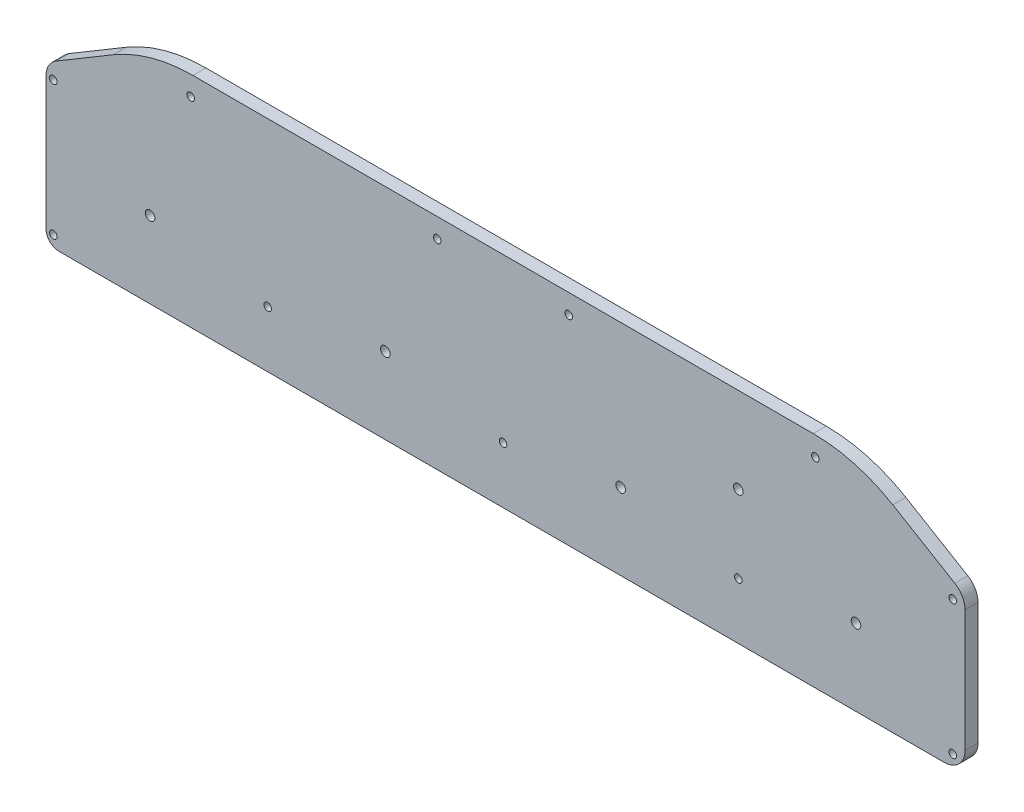
ISO-10303-21;
HEADER;
FILE_DESCRIPTION(('STEP AP214'),'2;1');
FILE_NAME('part.step','',(''),(''),'','','');
FILE_SCHEMA(('AUTOMOTIVE_DESIGN { 1 0 10303 214 1 1 1 1 }'));
ENDSEC;
DATA;
#1=APPLICATION_CONTEXT('core data for automotive mechanical design processes');
#2=APPLICATION_PROTOCOL_DEFINITION('international standard','automotive_design',2000,#1);
#3=PRODUCT_CONTEXT('',#1,'mechanical');
#4=PRODUCT('Part','Part','',(#3));
#5=PRODUCT_RELATED_PRODUCT_CATEGORY('part','',(#4));
#6=PRODUCT_DEFINITION_FORMATION('','',#4);
#7=PRODUCT_DEFINITION_CONTEXT('part definition',#1,'design');
#8=PRODUCT_DEFINITION('design','',#6,#7);
#9=PRODUCT_DEFINITION_SHAPE('','',#8);
#10=(LENGTH_UNIT() NAMED_UNIT(*) SI_UNIT(.MILLI.,.METRE.));
#11=(NAMED_UNIT(*) PLANE_ANGLE_UNIT() SI_UNIT($,.RADIAN.));
#12=(NAMED_UNIT(*) SI_UNIT($,.STERADIAN.) SOLID_ANGLE_UNIT());
#13=UNCERTAINTY_MEASURE_WITH_UNIT(LENGTH_MEASURE(1.E-05),#10,'distance_accuracy_value','');
#14=(GEOMETRIC_REPRESENTATION_CONTEXT(3) GLOBAL_UNCERTAINTY_ASSIGNED_CONTEXT((#13)) GLOBAL_UNIT_ASSIGNED_CONTEXT((#10,
#11,#12)) REPRESENTATION_CONTEXT('',''));
#15=CARTESIAN_POINT('',(0.,0.,0.));
#16=DIRECTION('',(0.,0.,1.));
#17=DIRECTION('',(1.,0.,0.));
#18=AXIS2_PLACEMENT_3D('',#15,#16,#17);
#19=CARTESIAN_POINT('',(0.,69.8499999999987,6.35));
#20=DIRECTION('',(0.,1.,0.));
#21=DIRECTION('',(0.,0.,1.));
#22=AXIS2_PLACEMENT_3D('',#19,#20,#21);
#23=PLANE('',#22);
#24=DIRECTION('',(1.,0.,0.));
#25=VECTOR('',#24,1.);
#26=CARTESIAN_POINT('',(0.,69.8499999999987,0.));
#27=LINE('',#26,#25);
#28=CARTESIAN_POINT('',(-151.75769199511,69.8499999999987,0.));
#29=VERTEX_POINT('',#28);
#30=CARTESIAN_POINT('',(151.757691995111,69.8499999999987,0.));
#31=VERTEX_POINT('',#30);
#32=EDGE_CURVE('E209',#29,#31,#27,.T.);
#33=ORIENTED_EDGE('',*,*,#32,.F.);
#34=DIRECTION('',(0.,0.,-1.));
#35=VECTOR('',#34,1.);
#36=CARTESIAN_POINT('',(-151.75769199511,69.8499999999987,6.35));
#37=LINE('',#36,#35);
#38=CARTESIAN_POINT('',(-151.75769199511,69.8499999999987,6.35));
#39=VERTEX_POINT('',#38);
#40=EDGE_CURVE('E12',#39,#29,#37,.T.);
#41=ORIENTED_EDGE('',*,*,#40,.F.);
#42=DIRECTION('',(1.,0.,0.));
#43=VECTOR('',#42,1.);
#44=CARTESIAN_POINT('',(0.,69.8499999999987,6.35));
#45=LINE('',#44,#43);
#46=CARTESIAN_POINT('',(151.757691995111,69.8499999999987,6.35));
#47=VERTEX_POINT('',#46);
#48=EDGE_CURVE('E655',#39,#47,#45,.T.);
#49=ORIENTED_EDGE('',*,*,#48,.T.);
#50=DIRECTION('',(0.,0.,-1.));
#51=VECTOR('',#50,1.);
#52=CARTESIAN_POINT('',(151.757691995111,69.8499999999987,6.35));
#53=LINE('',#52,#51);
#54=EDGE_CURVE('E55',#47,#31,#53,.T.);
#55=ORIENTED_EDGE('',*,*,#54,.T.);
#56=EDGE_LOOP('',(#33,#41,#49,#55));
#57=FACE_BOUND('',#56,.T.);
#58=ADVANCED_FACE('F38',(#57),#23,.T.);
#59=CARTESIAN_POINT('',(-151.757691995111,-6.35000000000131,6.35));
#60=DIRECTION('',(0.,0.,-1.));
#61=DIRECTION('',(-1.,0.,0.));
#62=AXIS2_PLACEMENT_3D('',#59,#60,#61);
#63=CYLINDRICAL_SURFACE('',#62,76.2);
#64=CARTESIAN_POINT('',(-151.757691995111,-6.35000000000131,0.));
#65=DIRECTION('',(0.,0.,1.));
#66=DIRECTION('',(1.,0.,0.));
#67=AXIS2_PLACEMENT_3D('',#64,#65,#66);
#68=CIRCLE('',#67,76.2);
#69=CARTESIAN_POINT('',(-190.732762109407,59.1281177920188,0.));
#70=VERTEX_POINT('',#69);
#71=EDGE_CURVE('E211',#29,#70,#68,.T.);
#72=ORIENTED_EDGE('',*,*,#71,.T.);
#73=DIRECTION('',(0.,0.,-1.));
#74=VECTOR('',#73,1.);
#75=CARTESIAN_POINT('',(-190.732762109407,59.1281177920188,6.35));
#76=LINE('',#75,#74);
#77=CARTESIAN_POINT('',(-190.732762109407,59.1281177920188,6.35));
#78=VERTEX_POINT('',#77);
#79=EDGE_CURVE('E47',#78,#70,#76,.T.);
#80=ORIENTED_EDGE('',*,*,#79,.F.);
#81=CARTESIAN_POINT('',(-151.757691995111,-6.35000000000131,6.35));
#82=DIRECTION('',(0.,0.,1.));
#83=DIRECTION('',(1.,0.,0.));
#84=AXIS2_PLACEMENT_3D('',#81,#82,#83);
#85=CIRCLE('',#84,76.2);
#86=EDGE_CURVE('E622',#39,#78,#85,.T.);
#87=ORIENTED_EDGE('',*,*,#86,.F.);
#88=ORIENTED_EDGE('',*,*,#40,.T.);
#89=EDGE_LOOP('',(#72,#80,#87,#88));
#90=FACE_BOUND('',#89,.T.);
#91=ADVANCED_FACE('F269',(#90),#63,.T.);
#92=CARTESIAN_POINT('',(-75.8863541230636,127.489074926747,6.35));
#93=DIRECTION('',(0.511483859767682,-0.859292884409707,0.));
#94=DIRECTION('',(0.859292884409707,0.511483859767682,0.));
#95=AXIS2_PLACEMENT_3D('',#92,#93,#94);
#96=PLANE('',#95);
#97=DIRECTION('',(-0.859292884409707,-0.511483859767682,0.));
#98=VECTOR('',#97,1.);
#99=CARTESIAN_POINT('',(-75.8863541230636,127.489074926747,0.));
#100=LINE('',#99,#98);
#101=CARTESIAN_POINT('',(-218.674059541862,42.4963931298433,0.));
#102=VERTEX_POINT('',#101);
#103=EDGE_CURVE('E214',#70,#102,#100,.T.);
#104=ORIENTED_EDGE('',*,*,#103,.T.);
#105=DIRECTION('',(0.,0.,-1.));
#106=VECTOR('',#105,1.);
#107=CARTESIAN_POINT('',(-218.674059541862,42.4963931298433,6.35));
#108=LINE('',#107,#106);
#109=CARTESIAN_POINT('',(-218.674059541862,42.4963931298433,6.35));
#110=VERTEX_POINT('',#109);
#111=EDGE_CURVE('E259',#110,#102,#108,.T.);
#112=ORIENTED_EDGE('',*,*,#111,.F.);
#113=DIRECTION('',(-0.859292884409707,-0.511483859767682,0.));
#114=VECTOR('',#113,1.);
#115=CARTESIAN_POINT('',(-75.8863541230636,127.489074926747,6.35));
#116=LINE('',#115,#114);
#117=EDGE_CURVE('E265',#78,#110,#116,.T.);
#118=ORIENTED_EDGE('',*,*,#117,.F.);
#119=ORIENTED_EDGE('',*,*,#79,.T.);
#120=EDGE_LOOP('',(#104,#112,#118,#119));
#121=FACE_BOUND('',#120,.T.);
#122=ADVANCED_FACE('F263',(#121),#96,.F.);
#123=CARTESIAN_POINT('',(-213.477383526623,33.7659774242407,6.35));
#124=DIRECTION('',(0.,0.,-1.));
#125=DIRECTION('',(-1.,0.,0.));
#126=AXIS2_PLACEMENT_3D('',#123,#124,#125);
#127=CYLINDRICAL_SURFACE('',#126,10.16);
#128=CARTESIAN_POINT('',(-213.477383526623,33.7659774242407,0.));
#129=DIRECTION('',(0.,0.,1.));
#130=DIRECTION('',(1.,0.,0.));
#131=AXIS2_PLACEMENT_3D('',#128,#129,#130);
#132=CIRCLE('',#131,10.16);
#133=CARTESIAN_POINT('',(-223.637383526623,33.7659774242406,0.));
#134=VERTEX_POINT('',#133);
#135=EDGE_CURVE('E217',#134,#102,#132,.F.);
#136=ORIENTED_EDGE('',*,*,#135,.F.);
#137=DIRECTION('',(0.,0.,-1.));
#138=VECTOR('',#137,1.);
#139=CARTESIAN_POINT('',(-223.637383526623,33.7659774242406,6.35));
#140=LINE('',#139,#138);
#141=CARTESIAN_POINT('',(-223.637383526623,33.7659774242406,6.35));
#142=VERTEX_POINT('',#141);
#143=EDGE_CURVE('E257',#142,#134,#140,.T.);
#144=ORIENTED_EDGE('',*,*,#143,.F.);
#145=CARTESIAN_POINT('',(-213.477383526623,33.7659774242407,6.35));
#146=DIRECTION('',(0.,0.,1.));
#147=DIRECTION('',(1.,0.,0.));
#148=AXIS2_PLACEMENT_3D('',#145,#146,#147);
#149=CIRCLE('',#148,10.16);
#150=EDGE_CURVE('E617',#142,#110,#149,.F.);
#151=ORIENTED_EDGE('',*,*,#150,.T.);
#152=ORIENTED_EDGE('',*,*,#111,.T.);
#153=EDGE_LOOP('',(#136,#144,#151,#152));
#154=FACE_BOUND('',#153,.T.);
#155=ADVANCED_FACE('F423',(#154),#127,.T.);
#156=CARTESIAN_POINT('',(-223.637383526623,0.,6.35));
#157=DIRECTION('',(1.,0.,0.));
#158=DIRECTION('',(0.,0.,-1.));
#159=AXIS2_PLACEMENT_3D('',#156,#157,#158);
#160=PLANE('',#159);
#161=DIRECTION('',(0.,-1.,0.));
#162=VECTOR('',#161,1.);
#163=CARTESIAN_POINT('',(-223.637383526623,0.,0.));
#164=LINE('',#163,#162);
#165=CARTESIAN_POINT('',(-223.637383526623,-31.0977563739976,0.));
#166=VERTEX_POINT('',#165);
#167=EDGE_CURVE('E220',#134,#166,#164,.T.);
#168=ORIENTED_EDGE('',*,*,#167,.T.);
#169=DIRECTION('',(0.,0.,-1.));
#170=VECTOR('',#169,1.);
#171=CARTESIAN_POINT('',(-223.637383526623,-31.0977563739976,6.35));
#172=LINE('',#171,#170);
#173=CARTESIAN_POINT('',(-223.637383526623,-31.0977563739976,6.35));
#174=VERTEX_POINT('',#173);
#175=EDGE_CURVE('E255',#174,#166,#172,.T.);
#176=ORIENTED_EDGE('',*,*,#175,.F.);
#177=DIRECTION('',(0.,-1.,0.));
#178=VECTOR('',#177,1.);
#179=CARTESIAN_POINT('',(-223.637383526623,0.,6.35));
#180=LINE('',#179,#178);
#181=EDGE_CURVE('E612',#142,#174,#180,.T.);
#182=ORIENTED_EDGE('',*,*,#181,.F.);
#183=ORIENTED_EDGE('',*,*,#143,.T.);
#184=EDGE_LOOP('',(#168,#176,#182,#183));
#185=FACE_BOUND('',#184,.T.);
#186=ADVANCED_FACE('F419',(#185),#160,.F.);
#187=CARTESIAN_POINT('',(-217.287383526623,-31.0977563739976,6.35));
#188=DIRECTION('',(0.,0.,-1.));
#189=DIRECTION('',(-1.,0.,0.));
#190=AXIS2_PLACEMENT_3D('',#187,#188,#189);
#191=CYLINDRICAL_SURFACE('',#190,6.35);
#192=CARTESIAN_POINT('',(-217.287383526623,-31.0977563739976,0.));
#193=DIRECTION('',(0.,0.,1.));
#194=DIRECTION('',(1.,0.,0.));
#195=AXIS2_PLACEMENT_3D('',#192,#193,#194);
#196=CIRCLE('',#195,6.35);
#197=CARTESIAN_POINT('',(-217.287383526623,-37.4477563739976,0.));
#198=VERTEX_POINT('',#197);
#199=EDGE_CURVE('E223',#198,#166,#196,.F.);
#200=ORIENTED_EDGE('',*,*,#199,.F.);
#201=DIRECTION('',(0.,0.,-1.));
#202=VECTOR('',#201,1.);
#203=CARTESIAN_POINT('',(-217.287383526623,-37.4477563739976,6.35));
#204=LINE('',#203,#202);
#205=CARTESIAN_POINT('',(-217.287383526623,-37.4477563739976,6.35));
#206=VERTEX_POINT('',#205);
#207=EDGE_CURVE('E253',#206,#198,#204,.T.);
#208=ORIENTED_EDGE('',*,*,#207,.F.);
#209=CARTESIAN_POINT('',(-217.287383526623,-31.0977563739976,6.35));
#210=DIRECTION('',(0.,0.,1.));
#211=DIRECTION('',(1.,0.,0.));
#212=AXIS2_PLACEMENT_3D('',#209,#210,#211);
#213=CIRCLE('',#212,6.35);
#214=EDGE_CURVE('E616',#206,#174,#213,.F.);
#215=ORIENTED_EDGE('',*,*,#214,.T.);
#216=ORIENTED_EDGE('',*,*,#175,.T.);
#217=EDGE_LOOP('',(#200,#208,#215,#216));
#218=FACE_BOUND('',#217,.T.);
#219=ADVANCED_FACE('F415',(#218),#191,.T.);
#220=CARTESIAN_POINT('',(0.,-37.4477563739976,6.35));
#221=DIRECTION('',(0.,-1.,0.));
#222=DIRECTION('',(1.,0.,0.));
#223=AXIS2_PLACEMENT_3D('',#220,#221,#222);
#224=PLANE('',#223);
#225=DIRECTION('',(-1.,0.,0.));
#226=VECTOR('',#225,1.);
#227=CARTESIAN_POINT('',(0.,-37.4477563739976,0.));
#228=LINE('',#227,#226);
#229=CARTESIAN_POINT('',(215.900000000007,-37.4477563739976,0.));
#230=VERTEX_POINT('',#229);
#231=EDGE_CURVE('E226',#230,#198,#228,.T.);
#232=ORIENTED_EDGE('',*,*,#231,.F.);
#233=DIRECTION('',(0.,0.,-1.));
#234=VECTOR('',#233,1.);
#235=CARTESIAN_POINT('',(215.900000000007,-37.4477563739976,6.35));
#236=LINE('',#235,#234);
#237=CARTESIAN_POINT('',(215.900000000007,-37.4477563739976,6.35));
#238=VERTEX_POINT('',#237);
#239=EDGE_CURVE('E251',#238,#230,#236,.T.);
#240=ORIENTED_EDGE('',*,*,#239,.F.);
#241=DIRECTION('',(-1.,0.,0.));
#242=VECTOR('',#241,1.);
#243=CARTESIAN_POINT('',(0.,-37.4477563739976,6.35));
#244=LINE('',#243,#242);
#245=EDGE_CURVE('E635',#238,#206,#244,.T.);
#246=ORIENTED_EDGE('',*,*,#245,.T.);
#247=ORIENTED_EDGE('',*,*,#207,.T.);
#248=EDGE_LOOP('',(#232,#240,#246,#247));
#249=FACE_BOUND('',#248,.T.);
#250=ADVANCED_FACE('F411',(#249),#224,.T.);
#251=CARTESIAN_POINT('',(215.900000000007,-27.2877563739976,6.35));
#252=DIRECTION('',(0.,0.,-1.));
#253=DIRECTION('',(-1.,0.,0.));
#254=AXIS2_PLACEMENT_3D('',#251,#252,#253);
#255=CYLINDRICAL_SURFACE('',#254,10.16);
#256=CARTESIAN_POINT('',(215.900000000007,-27.2877563739976,0.));
#257=DIRECTION('',(0.,0.,1.));
#258=DIRECTION('',(1.,0.,0.));
#259=AXIS2_PLACEMENT_3D('',#256,#257,#258);
#260=CIRCLE('',#259,10.16);
#261=CARTESIAN_POINT('',(226.060000000007,-27.2877563739976,0.));
#262=VERTEX_POINT('',#261);
#263=EDGE_CURVE('E229',#230,#262,#260,.T.);
#264=ORIENTED_EDGE('',*,*,#263,.T.);
#265=DIRECTION('',(0.,0.,-1.));
#266=VECTOR('',#265,1.);
#267=CARTESIAN_POINT('',(226.060000000007,-27.2877563739976,6.35));
#268=LINE('',#267,#266);
#269=CARTESIAN_POINT('',(226.060000000007,-27.2877563739976,6.35));
#270=VERTEX_POINT('',#269);
#271=EDGE_CURVE('E248',#270,#262,#268,.T.);
#272=ORIENTED_EDGE('',*,*,#271,.F.);
#273=CARTESIAN_POINT('',(215.900000000007,-27.2877563739976,6.35));
#274=DIRECTION('',(0.,0.,1.));
#275=DIRECTION('',(1.,0.,0.));
#276=AXIS2_PLACEMENT_3D('',#273,#274,#275);
#277=CIRCLE('',#276,10.16);
#278=EDGE_CURVE('E639',#238,#270,#277,.T.);
#279=ORIENTED_EDGE('',*,*,#278,.F.);
#280=ORIENTED_EDGE('',*,*,#239,.T.);
#281=EDGE_LOOP('',(#264,#272,#279,#280));
#282=FACE_BOUND('',#281,.T.);
#283=ADVANCED_FACE('F407',(#282),#255,.T.);
#284=CARTESIAN_POINT('',(226.060000000004,2.65242427561563E-11,6.35));
#285=DIRECTION('',(-1.,-1.17332755711563E-13,0.));
#286=DIRECTION('',(1.17332755711563E-13,-1.,0.));
#287=AXIS2_PLACEMENT_3D('',#284,#285,#286);
#288=PLANE('',#287);
#289=DIRECTION('',(-1.17332755711563E-13,1.,0.));
#290=VECTOR('',#289,1.);
#291=CARTESIAN_POINT('',(226.060000000004,2.65242427561563E-11,0.));
#292=LINE('',#291,#290);
#293=CARTESIAN_POINT('',(226.06,32.3239438091356,0.));
#294=VERTEX_POINT('',#293);
#295=EDGE_CURVE('E232',#262,#294,#292,.T.);
#296=ORIENTED_EDGE('',*,*,#295,.T.);
#297=DIRECTION('',(0.,0.,-1.));
#298=VECTOR('',#297,1.);
#299=CARTESIAN_POINT('',(226.06,32.3239438091356,6.35));
#300=LINE('',#299,#298);
#301=CARTESIAN_POINT('',(226.06,32.3239438091356,6.35));
#302=VERTEX_POINT('',#301);
#303=EDGE_CURVE('E138',#302,#294,#300,.T.);
#304=ORIENTED_EDGE('',*,*,#303,.F.);
#305=DIRECTION('',(-1.17332755711563E-13,1.,0.));
#306=VECTOR('',#305,1.);
#307=CARTESIAN_POINT('',(226.060000000004,2.65242427561563E-11,6.35));
#308=LINE('',#307,#306);
#309=EDGE_CURVE('E148',#270,#302,#308,.T.);
#310=ORIENTED_EDGE('',*,*,#309,.F.);
#311=ORIENTED_EDGE('',*,*,#271,.T.);
#312=EDGE_LOOP('',(#296,#304,#310,#311));
#313=FACE_BOUND('',#312,.T.);
#314=ADVANCED_FACE('F404',(#313),#288,.F.);
#315=CARTESIAN_POINT('',(215.9,32.3239438091357,6.35));
#316=DIRECTION('',(0.,0.,-1.));
#317=DIRECTION('',(-1.,0.,0.));
#318=AXIS2_PLACEMENT_3D('',#315,#316,#317);
#319=CYLINDRICAL_SURFACE('',#318,10.16);
#320=CARTESIAN_POINT('',(215.9,32.3239438091357,0.));
#321=DIRECTION('',(0.,0.,1.));
#322=DIRECTION('',(1.,0.,0.));
#323=AXIS2_PLACEMENT_3D('',#320,#321,#322);
#324=CIRCLE('',#323,10.16);
#325=CARTESIAN_POINT('',(221.09667601524,41.0543595147383,0.));
#326=VERTEX_POINT('',#325);
#327=EDGE_CURVE('E134',#326,#294,#324,.F.);
#328=ORIENTED_EDGE('',*,*,#327,.F.);
#329=DIRECTION('',(0.,0.,-1.));
#330=VECTOR('',#329,1.);
#331=CARTESIAN_POINT('',(221.09667601524,41.0543595147383,6.35));
#332=LINE('',#331,#330);
#333=CARTESIAN_POINT('',(221.09667601524,41.0543595147383,6.35));
#334=VERTEX_POINT('',#333);
#335=EDGE_CURVE('E129',#334,#326,#332,.T.);
#336=ORIENTED_EDGE('',*,*,#335,.F.);
#337=CARTESIAN_POINT('',(215.9,32.3239438091357,6.35));
#338=DIRECTION('',(0.,0.,1.));
#339=DIRECTION('',(1.,0.,0.));
#340=AXIS2_PLACEMENT_3D('',#337,#338,#339);
#341=CIRCLE('',#340,10.16);
#342=EDGE_CURVE('E132',#334,#302,#341,.F.);
#343=ORIENTED_EDGE('',*,*,#342,.T.);
#344=ORIENTED_EDGE('',*,*,#303,.T.);
#345=EDGE_LOOP('',(#328,#336,#343,#344));
#346=FACE_BOUND('',#345,.T.);
#347=ADVANCED_FACE('F131',(#346),#319,.T.);
#348=CARTESIAN_POINT('',(75.886354123061,127.489074926747,6.35));
#349=DIRECTION('',(0.51148385976767,0.859292884409714,0.));
#350=DIRECTION('',(-0.859292884409714,0.511483859767671,0.));
#351=AXIS2_PLACEMENT_3D('',#348,#349,#350);
#352=PLANE('',#351);
#353=DIRECTION('',(0.859292884409714,-0.511483859767671,0.));
#354=VECTOR('',#353,1.);
#355=CARTESIAN_POINT('',(75.886354123061,127.489074926747,0.));
#356=LINE('',#355,#354);
#357=CARTESIAN_POINT('',(190.732762109407,59.1281177920189,0.));
#358=VERTEX_POINT('',#357);
#359=EDGE_CURVE('E236',#358,#326,#356,.T.);
#360=ORIENTED_EDGE('',*,*,#359,.F.);
#361=DIRECTION('',(0.,0.,-1.));
#362=VECTOR('',#361,1.);
#363=CARTESIAN_POINT('',(190.732762109407,59.1281177920189,6.35));
#364=LINE('',#363,#362);
#365=CARTESIAN_POINT('',(190.732762109407,59.1281177920189,6.35));
#366=VERTEX_POINT('',#365);
#367=EDGE_CURVE('E92',#366,#358,#364,.T.);
#368=ORIENTED_EDGE('',*,*,#367,.F.);
#369=DIRECTION('',(0.859292884409714,-0.511483859767671,0.));
#370=VECTOR('',#369,1.);
#371=CARTESIAN_POINT('',(75.886354123061,127.489074926747,6.35));
#372=LINE('',#371,#370);
#373=EDGE_CURVE('E146',#366,#334,#372,.T.);
#374=ORIENTED_EDGE('',*,*,#373,.T.);
#375=ORIENTED_EDGE('',*,*,#335,.T.);
#376=EDGE_LOOP('',(#360,#368,#374,#375));
#377=FACE_BOUND('',#376,.T.);
#378=ADVANCED_FACE('F152',(#377),#352,.T.);
#379=CARTESIAN_POINT('',(151.75769199511,-6.35000000000009,6.35));
#380=DIRECTION('',(0.,0.,-1.));
#381=DIRECTION('',(-1.,0.,0.));
#382=AXIS2_PLACEMENT_3D('',#379,#380,#381);
#383=CYLINDRICAL_SURFACE('',#382,76.1999999999991);
#384=CARTESIAN_POINT('',(151.75769199511,-6.35000000000009,0.));
#385=DIRECTION('',(0.,0.,1.));
#386=DIRECTION('',(1.,0.,0.));
#387=AXIS2_PLACEMENT_3D('',#384,#385,#386);
#388=CIRCLE('',#387,76.1999999999991);
#389=EDGE_CURVE('E238',#31,#358,#388,.F.);
#390=ORIENTED_EDGE('',*,*,#389,.F.);
#391=ORIENTED_EDGE('',*,*,#54,.F.);
#392=CARTESIAN_POINT('',(151.75769199511,-6.35000000000009,6.35));
#393=DIRECTION('',(0.,0.,1.));
#394=DIRECTION('',(1.,0.,0.));
#395=AXIS2_PLACEMENT_3D('',#392,#393,#394);
#396=CIRCLE('',#395,76.1999999999991);
#397=EDGE_CURVE('E154',#47,#366,#396,.F.);
#398=ORIENTED_EDGE('',*,*,#397,.T.);
#399=ORIENTED_EDGE('',*,*,#367,.T.);
#400=EDGE_LOOP('',(#390,#391,#398,#399));
#401=FACE_BOUND('',#400,.T.);
#402=ADVANCED_FACE('F285',(#401),#383,.T.);
#403=CARTESIAN_POINT('',(-220.058830168651,-31.7527552367277,6.35));
#404=DIRECTION('',(0.,0.,-1.));
#405=DIRECTION('',(-1.,0.,0.));
#406=AXIS2_PLACEMENT_3D('',#403,#404,#405);
#407=CYLINDRICAL_SURFACE('',#406,1.85000011);
#408=CARTESIAN_POINT('',(-220.058830168651,-31.7527552367277,6.35));
#409=DIRECTION('',(0.,0.,1.));
#410=DIRECTION('',(1.,0.,0.));
#411=AXIS2_PLACEMENT_3D('',#408,#409,#410);
#412=CIRCLE('',#411,1.85000011);
#413=CARTESIAN_POINT('',(-218.208830058651,-31.7527552367277,6.35));
#414=VERTEX_POINT('',#413);
#415=EDGE_CURVE('E659',#414,#414,#412,.T.);
#416=ORIENTED_EDGE('',*,*,#415,.T.);
#417=EDGE_LOOP('',(#416));
#418=FACE_BOUND('',#417,.T.);
#419=CARTESIAN_POINT('',(-220.058830168651,-31.7527552367277,0.));
#420=DIRECTION('',(0.,0.,1.));
#421=DIRECTION('',(1.,0.,0.));
#422=AXIS2_PLACEMENT_3D('',#419,#420,#421);
#423=CIRCLE('',#422,1.85000011);
#424=CARTESIAN_POINT('',(-218.208830058651,-31.7527552367277,0.));
#425=VERTEX_POINT('',#424);
#426=EDGE_CURVE('E206',#425,#425,#423,.T.);
#427=ORIENTED_EDGE('',*,*,#426,.F.);
#428=EDGE_LOOP('',(#427));
#429=FACE_BOUND('',#428,.T.);
#430=ADVANCED_FACE('F281',(#418,#429),#407,.F.);
#431=CARTESIAN_POINT('',(115.1462391,27.951065379152,6.35));
#432=DIRECTION('',(0.,0.,-1.));
#433=DIRECTION('',(-1.,0.,0.));
#434=AXIS2_PLACEMENT_3D('',#431,#432,#433);
#435=CYLINDRICAL_SURFACE('',#434,2.35);
#436=CARTESIAN_POINT('',(115.1462391,27.951065379152,6.35));
#437=DIRECTION('',(0.,0.,1.));
#438=DIRECTION('',(1.,0.,0.));
#439=AXIS2_PLACEMENT_3D('',#436,#437,#438);
#440=CIRCLE('',#439,2.35);
#441=CARTESIAN_POINT('',(117.4962391,27.951065379152,6.35));
#442=VERTEX_POINT('',#441);
#443=EDGE_CURVE('E664',#442,#442,#440,.T.);
#444=ORIENTED_EDGE('',*,*,#443,.T.);
#445=EDGE_LOOP('',(#444));
#446=FACE_BOUND('',#445,.T.);
#447=CARTESIAN_POINT('',(115.1462391,27.951065379152,0.));
#448=DIRECTION('',(0.,0.,1.));
#449=DIRECTION('',(1.,0.,0.));
#450=AXIS2_PLACEMENT_3D('',#447,#448,#449);
#451=CIRCLE('',#450,2.35);
#452=CARTESIAN_POINT('',(117.4962391,27.951065379152,0.));
#453=VERTEX_POINT('',#452);
#454=EDGE_CURVE('E203',#453,#453,#451,.T.);
#455=ORIENTED_EDGE('',*,*,#454,.F.);
#456=EDGE_LOOP('',(#455));
#457=FACE_BOUND('',#456,.T.);
#458=ADVANCED_FACE('F284',(#446,#457),#435,.F.);
#459=CARTESIAN_POINT('',(220.058830168651,-31.7527552367277,6.35));
#460=DIRECTION('',(0.,0.,-1.));
#461=DIRECTION('',(-1.,0.,0.));
#462=AXIS2_PLACEMENT_3D('',#459,#460,#461);
#463=CYLINDRICAL_SURFACE('',#462,1.85000011);
#464=CARTESIAN_POINT('',(220.058830168651,-31.7527552367277,6.35));
#465=DIRECTION('',(0.,0.,1.));
#466=DIRECTION('',(1.,0.,0.));
#467=AXIS2_PLACEMENT_3D('',#464,#465,#466);
#468=CIRCLE('',#467,1.85000011);
#469=CARTESIAN_POINT('',(221.908830278651,-31.7527552367277,6.35));
#470=VERTEX_POINT('',#469);
#471=EDGE_CURVE('E672',#470,#470,#468,.T.);
#472=ORIENTED_EDGE('',*,*,#471,.T.);
#473=EDGE_LOOP('',(#472));
#474=FACE_BOUND('',#473,.T.);
#475=CARTESIAN_POINT('',(220.058830168651,-31.7527552367277,0.));
#476=DIRECTION('',(0.,0.,1.));
#477=DIRECTION('',(1.,0.,0.));
#478=AXIS2_PLACEMENT_3D('',#475,#476,#477);
#479=CIRCLE('',#478,1.85000011);
#480=CARTESIAN_POINT('',(221.908830278651,-31.7527552367277,0.));
#481=VERTEX_POINT('',#480);
#482=EDGE_CURVE('E200',#481,#481,#479,.T.);
#483=ORIENTED_EDGE('',*,*,#482,.F.);
#484=EDGE_LOOP('',(#483));
#485=FACE_BOUND('',#484,.T.);
#486=ADVANCED_FACE('F289',(#474,#485),#463,.F.);
#487=CARTESIAN_POINT('',(172.72,0.,6.35));
#488=DIRECTION('',(0.,0.,-1.));
#489=DIRECTION('',(-1.,0.,0.));
#490=AXIS2_PLACEMENT_3D('',#487,#488,#489);
#491=CYLINDRICAL_SURFACE('',#490,2.35);
#492=CARTESIAN_POINT('',(172.72,0.,6.35));
#493=DIRECTION('',(0.,0.,1.));
#494=DIRECTION('',(1.,0.,0.));
#495=AXIS2_PLACEMENT_3D('',#492,#493,#494);
#496=CIRCLE('',#495,2.35);
#497=CARTESIAN_POINT('',(175.07,0.,6.35));
#498=VERTEX_POINT('',#497);
#499=EDGE_CURVE('E676',#498,#498,#496,.T.);
#500=ORIENTED_EDGE('',*,*,#499,.T.);
#501=EDGE_LOOP('',(#500));
#502=FACE_BOUND('',#501,.T.);
#503=CARTESIAN_POINT('',(172.72,0.,0.));
#504=DIRECTION('',(0.,0.,1.));
#505=DIRECTION('',(1.,0.,0.));
#506=AXIS2_PLACEMENT_3D('',#503,#504,#505);
#507=CIRCLE('',#506,2.35);
#508=CARTESIAN_POINT('',(175.07,0.,0.));
#509=VERTEX_POINT('',#508);
#510=EDGE_CURVE('E197',#509,#509,#507,.T.);
#511=ORIENTED_EDGE('',*,*,#510,.F.);
#512=EDGE_LOOP('',(#511));
#513=FACE_BOUND('',#512,.T.);
#514=ADVANCED_FACE('F293',(#502,#513),#491,.F.);
#515=CARTESIAN_POINT('',(57.5724782,0.,6.35));
#516=DIRECTION('',(0.,0.,-1.));
#517=DIRECTION('',(-1.,0.,0.));
#518=AXIS2_PLACEMENT_3D('',#515,#516,#517);
#519=CYLINDRICAL_SURFACE('',#518,2.35);
#520=CARTESIAN_POINT('',(57.5724782,0.,6.35));
#521=DIRECTION('',(0.,0.,1.));
#522=DIRECTION('',(1.,0.,0.));
#523=AXIS2_PLACEMENT_3D('',#520,#521,#522);
#524=CIRCLE('',#523,2.35);
#525=CARTESIAN_POINT('',(59.9224782,0.,6.35));
#526=VERTEX_POINT('',#525);
#527=EDGE_CURVE('E681',#526,#526,#524,.T.);
#528=ORIENTED_EDGE('',*,*,#527,.T.);
#529=EDGE_LOOP('',(#528));
#530=FACE_BOUND('',#529,.T.);
#531=CARTESIAN_POINT('',(57.5724782,0.,0.));
#532=DIRECTION('',(0.,0.,1.));
#533=DIRECTION('',(1.,0.,0.));
#534=AXIS2_PLACEMENT_3D('',#531,#532,#533);
#535=CIRCLE('',#534,2.35);
#536=CARTESIAN_POINT('',(59.9224782,0.,0.));
#537=VERTEX_POINT('',#536);
#538=EDGE_CURVE('E194',#537,#537,#535,.T.);
#539=ORIENTED_EDGE('',*,*,#538,.F.);
#540=EDGE_LOOP('',(#539));
#541=FACE_BOUND('',#540,.T.);
#542=ADVANCED_FACE('F297',(#530,#541),#519,.F.);
#543=CARTESIAN_POINT('',(-57.57418,0.,6.35));
#544=DIRECTION('',(0.,0.,-1.));
#545=DIRECTION('',(-1.,0.,0.));
#546=AXIS2_PLACEMENT_3D('',#543,#544,#545);
#547=CYLINDRICAL_SURFACE('',#546,2.35);
#548=CARTESIAN_POINT('',(-57.57418,0.,6.35));
#549=DIRECTION('',(0.,0.,1.));
#550=DIRECTION('',(1.,0.,0.));
#551=AXIS2_PLACEMENT_3D('',#548,#549,#550);
#552=CIRCLE('',#551,2.35);
#553=CARTESIAN_POINT('',(-55.22418,0.,6.35));
#554=VERTEX_POINT('',#553);
#555=EDGE_CURVE('E686',#554,#554,#552,.T.);
#556=ORIENTED_EDGE('',*,*,#555,.T.);
#557=EDGE_LOOP('',(#556));
#558=FACE_BOUND('',#557,.T.);
#559=CARTESIAN_POINT('',(-57.57418,0.,0.));
#560=DIRECTION('',(0.,0.,1.));
#561=DIRECTION('',(1.,0.,0.));
#562=AXIS2_PLACEMENT_3D('',#559,#560,#561);
#563=CIRCLE('',#562,2.35);
#564=CARTESIAN_POINT('',(-55.22418,0.,0.));
#565=VERTEX_POINT('',#564);
#566=EDGE_CURVE('E191',#565,#565,#563,.T.);
#567=ORIENTED_EDGE('',*,*,#566,.F.);
#568=EDGE_LOOP('',(#567));
#569=FACE_BOUND('',#568,.T.);
#570=ADVANCED_FACE('F301',(#558,#569),#547,.F.);
#571=CARTESIAN_POINT('',(-172.72,0.,6.35));
#572=DIRECTION('',(0.,0.,-1.));
#573=DIRECTION('',(-1.,0.,0.));
#574=AXIS2_PLACEMENT_3D('',#571,#572,#573);
#575=CYLINDRICAL_SURFACE('',#574,2.35);
#576=CARTESIAN_POINT('',(-172.72,0.,6.35));
#577=DIRECTION('',(0.,0.,1.));
#578=DIRECTION('',(1.,0.,0.));
#579=AXIS2_PLACEMENT_3D('',#576,#577,#578);
#580=CIRCLE('',#579,2.35);
#581=CARTESIAN_POINT('',(-170.37,0.,6.35));
#582=VERTEX_POINT('',#581);
#583=EDGE_CURVE('E694',#582,#582,#580,.T.);
#584=ORIENTED_EDGE('',*,*,#583,.T.);
#585=EDGE_LOOP('',(#584));
#586=FACE_BOUND('',#585,.T.);
#587=CARTESIAN_POINT('',(-172.72,0.,0.));
#588=DIRECTION('',(0.,0.,1.));
#589=DIRECTION('',(1.,0.,0.));
#590=AXIS2_PLACEMENT_3D('',#587,#588,#589);
#591=CIRCLE('',#590,2.35);
#592=CARTESIAN_POINT('',(-170.37,0.,0.));
#593=VERTEX_POINT('',#592);
#594=EDGE_CURVE('E188',#593,#593,#591,.T.);
#595=ORIENTED_EDGE('',*,*,#594,.F.);
#596=EDGE_LOOP('',(#595));
#597=FACE_BOUND('',#596,.T.);
#598=ADVANCED_FACE('F305',(#586,#597),#575,.F.);
#599=CARTESIAN_POINT('',(-32.17418,60.3249999999998,6.35));
#600=DIRECTION('',(0.,0.,-1.));
#601=DIRECTION('',(-1.,0.,0.));
#602=AXIS2_PLACEMENT_3D('',#599,#600,#601);
#603=CYLINDRICAL_SURFACE('',#602,1.85);
#604=CARTESIAN_POINT('',(-32.17418,60.3249999999998,6.35));
#605=DIRECTION('',(0.,0.,1.));
#606=DIRECTION('',(1.,0.,0.));
#607=AXIS2_PLACEMENT_3D('',#604,#605,#606);
#608=CIRCLE('',#607,1.85);
#609=CARTESIAN_POINT('',(-30.32418,60.3249999999998,6.35));
#610=VERTEX_POINT('',#609);
#611=EDGE_CURVE('E698',#610,#610,#608,.T.);
#612=ORIENTED_EDGE('',*,*,#611,.T.);
#613=EDGE_LOOP('',(#612));
#614=FACE_BOUND('',#613,.T.);
#615=CARTESIAN_POINT('',(-32.17418,60.3249999999998,0.));
#616=DIRECTION('',(0.,0.,1.));
#617=DIRECTION('',(1.,0.,0.));
#618=AXIS2_PLACEMENT_3D('',#615,#616,#617);
#619=CIRCLE('',#618,1.85);
#620=CARTESIAN_POINT('',(-30.32418,60.3249999999998,0.));
#621=VERTEX_POINT('',#620);
#622=EDGE_CURVE('E185',#621,#621,#619,.T.);
#623=ORIENTED_EDGE('',*,*,#622,.F.);
#624=EDGE_LOOP('',(#623));
#625=FACE_BOUND('',#624,.T.);
#626=ADVANCED_FACE('F309',(#614,#625),#603,.F.);
#627=CARTESIAN_POINT('',(-152.82418,60.3249999999993,6.35));
#628=DIRECTION('',(0.,0.,-1.));
#629=DIRECTION('',(-1.,0.,0.));
#630=AXIS2_PLACEMENT_3D('',#627,#628,#629);
#631=CYLINDRICAL_SURFACE('',#630,1.85);
#632=CARTESIAN_POINT('',(-152.82418,60.3249999999993,6.35));
#633=DIRECTION('',(0.,0.,1.));
#634=DIRECTION('',(1.,0.,0.));
#635=AXIS2_PLACEMENT_3D('',#632,#633,#634);
#636=CIRCLE('',#635,1.85);
#637=CARTESIAN_POINT('',(-150.97418,60.3249999999993,6.35));
#638=VERTEX_POINT('',#637);
#639=EDGE_CURVE('E703',#638,#638,#636,.T.);
#640=ORIENTED_EDGE('',*,*,#639,.T.);
#641=EDGE_LOOP('',(#640));
#642=FACE_BOUND('',#641,.T.);
#643=CARTESIAN_POINT('',(-152.82418,60.3249999999993,0.));
#644=DIRECTION('',(0.,0.,1.));
#645=DIRECTION('',(1.,0.,0.));
#646=AXIS2_PLACEMENT_3D('',#643,#644,#645);
#647=CIRCLE('',#646,1.85);
#648=CARTESIAN_POINT('',(-150.97418,60.3249999999993,0.));
#649=VERTEX_POINT('',#648);
#650=EDGE_CURVE('E182',#649,#649,#647,.T.);
#651=ORIENTED_EDGE('',*,*,#650,.F.);
#652=EDGE_LOOP('',(#651));
#653=FACE_BOUND('',#652,.T.);
#654=ADVANCED_FACE('F313',(#642,#653),#631,.F.);
#655=CARTESIAN_POINT('',(152.82418,60.3250000000002,6.35));
#656=DIRECTION('',(0.,0.,-1.));
#657=DIRECTION('',(-1.,0.,0.));
#658=AXIS2_PLACEMENT_3D('',#655,#656,#657);
#659=CYLINDRICAL_SURFACE('',#658,1.85);
#660=CARTESIAN_POINT('',(152.82418,60.3250000000002,6.35));
#661=DIRECTION('',(0.,0.,1.));
#662=DIRECTION('',(1.,0.,0.));
#663=AXIS2_PLACEMENT_3D('',#660,#661,#662);
#664=CIRCLE('',#663,1.85);
#665=CARTESIAN_POINT('',(154.67418,60.3250000000002,6.35));
#666=VERTEX_POINT('',#665);
#667=EDGE_CURVE('E708',#666,#666,#664,.F.);
#668=ORIENTED_EDGE('',*,*,#667,.F.);
#669=EDGE_LOOP('',(#668));
#670=FACE_BOUND('',#669,.T.);
#671=CARTESIAN_POINT('',(152.82418,60.3250000000002,0.));
#672=DIRECTION('',(0.,0.,1.));
#673=DIRECTION('',(1.,0.,0.));
#674=AXIS2_PLACEMENT_3D('',#671,#672,#673);
#675=CIRCLE('',#674,1.85);
#676=CARTESIAN_POINT('',(154.67418,60.3250000000002,0.));
#677=VERTEX_POINT('',#676);
#678=EDGE_CURVE('E179',#677,#677,#675,.F.);
#679=ORIENTED_EDGE('',*,*,#678,.T.);
#680=EDGE_LOOP('',(#679));
#681=FACE_BOUND('',#680,.T.);
#682=ADVANCED_FACE('F317',(#670,#681),#659,.F.);
#683=CARTESIAN_POINT('',(115.1453882,-9.8971819591649,6.35));
#684=DIRECTION('',(0.,0.,-1.));
#685=DIRECTION('',(-1.,0.,0.));
#686=AXIS2_PLACEMENT_3D('',#683,#684,#685);
#687=CYLINDRICAL_SURFACE('',#686,1.85);
#688=CARTESIAN_POINT('',(115.1453882,-9.8971819591649,6.35));
#689=DIRECTION('',(0.,0.,1.));
#690=DIRECTION('',(1.,0.,0.));
#691=AXIS2_PLACEMENT_3D('',#688,#689,#690);
#692=CIRCLE('',#691,1.85);
#693=CARTESIAN_POINT('',(116.9953882,-9.8971819591649,6.35));
#694=VERTEX_POINT('',#693);
#695=EDGE_CURVE('E714',#694,#694,#692,.T.);
#696=ORIENTED_EDGE('',*,*,#695,.T.);
#697=EDGE_LOOP('',(#696));
#698=FACE_BOUND('',#697,.T.);
#699=CARTESIAN_POINT('',(115.1453882,-9.8971819591649,0.));
#700=DIRECTION('',(0.,0.,1.));
#701=DIRECTION('',(1.,0.,0.));
#702=AXIS2_PLACEMENT_3D('',#699,#700,#701);
#703=CIRCLE('',#702,1.85);
#704=CARTESIAN_POINT('',(116.9953882,-9.8971819591649,0.));
#705=VERTEX_POINT('',#704);
#706=EDGE_CURVE('E176',#705,#705,#703,.T.);
#707=ORIENTED_EDGE('',*,*,#706,.F.);
#708=EDGE_LOOP('',(#707));
#709=FACE_BOUND('',#708,.T.);
#710=ADVANCED_FACE('F321',(#698,#709),#687,.F.);
#711=CARTESIAN_POINT('',(-115.14709,-9.89718195916497,6.35));
#712=DIRECTION('',(0.,0.,-1.));
#713=DIRECTION('',(-1.,0.,0.));
#714=AXIS2_PLACEMENT_3D('',#711,#712,#713);
#715=CYLINDRICAL_SURFACE('',#714,1.85);
#716=CARTESIAN_POINT('',(-115.14709,-9.89718195916497,6.35));
#717=DIRECTION('',(0.,0.,1.));
#718=DIRECTION('',(1.,0.,0.));
#719=AXIS2_PLACEMENT_3D('',#716,#717,#718);
#720=CIRCLE('',#719,1.85);
#721=CARTESIAN_POINT('',(-113.29709,-9.89718195916497,6.35));
#722=VERTEX_POINT('',#721);
#723=EDGE_CURVE('E718',#722,#722,#720,.T.);
#724=ORIENTED_EDGE('',*,*,#723,.T.);
#725=EDGE_LOOP('',(#724));
#726=FACE_BOUND('',#725,.T.);
#727=CARTESIAN_POINT('',(-115.14709,-9.89718195916497,0.));
#728=DIRECTION('',(0.,0.,1.));
#729=DIRECTION('',(1.,0.,0.));
#730=AXIS2_PLACEMENT_3D('',#727,#728,#729);
#731=CIRCLE('',#730,1.85);
#732=CARTESIAN_POINT('',(-113.29709,-9.89718195916497,0.));
#733=VERTEX_POINT('',#732);
#734=EDGE_CURVE('E173',#733,#733,#731,.T.);
#735=ORIENTED_EDGE('',*,*,#734,.F.);
#736=EDGE_LOOP('',(#735));
#737=FACE_BOUND('',#736,.T.);
#738=ADVANCED_FACE('F325',(#726,#737),#715,.F.);
#739=CARTESIAN_POINT('',(-0.00126999999999766,-9.89718195916494,6.35));
#740=DIRECTION('',(0.,0.,-1.));
#741=DIRECTION('',(-1.,0.,0.));
#742=AXIS2_PLACEMENT_3D('',#739,#740,#741);
#743=CYLINDRICAL_SURFACE('',#742,1.85);
#744=CARTESIAN_POINT('',(-0.00126999999999766,-9.89718195916494,6.35));
#745=DIRECTION('',(0.,0.,1.));
#746=DIRECTION('',(1.,0.,0.));
#747=AXIS2_PLACEMENT_3D('',#744,#745,#746);
#748=CIRCLE('',#747,1.85);
#749=CARTESIAN_POINT('',(1.84873000000001,-9.89718195916494,6.35));
#750=VERTEX_POINT('',#749);
#751=EDGE_CURVE('E723',#750,#750,#748,.T.);
#752=ORIENTED_EDGE('',*,*,#751,.T.);
#753=EDGE_LOOP('',(#752));
#754=FACE_BOUND('',#753,.T.);
#755=CARTESIAN_POINT('',(-0.00126999999999766,-9.89718195916494,0.));
#756=DIRECTION('',(0.,0.,1.));
#757=DIRECTION('',(1.,0.,0.));
#758=AXIS2_PLACEMENT_3D('',#755,#756,#757);
#759=CIRCLE('',#758,1.85);
#760=CARTESIAN_POINT('',(1.84873000000001,-9.89718195916494,0.));
#761=VERTEX_POINT('',#760);
#762=EDGE_CURVE('E170',#761,#761,#759,.T.);
#763=ORIENTED_EDGE('',*,*,#762,.F.);
#764=EDGE_LOOP('',(#763));
#765=FACE_BOUND('',#764,.T.);
#766=ADVANCED_FACE('F329',(#754,#765),#743,.F.);
#767=CARTESIAN_POINT('',(220.058830168651,33.813450120465,6.35));
#768=DIRECTION('',(0.,0.,-1.));
#769=DIRECTION('',(-1.,0.,0.));
#770=AXIS2_PLACEMENT_3D('',#767,#768,#769);
#771=CYLINDRICAL_SURFACE('',#770,1.85);
#772=CARTESIAN_POINT('',(220.058830168651,33.813450120465,6.35));
#773=DIRECTION('',(0.,0.,1.));
#774=DIRECTION('',(1.,0.,0.));
#775=AXIS2_PLACEMENT_3D('',#772,#773,#774);
#776=CIRCLE('',#775,1.85);
#777=CARTESIAN_POINT('',(221.908830168651,33.813450120465,6.35));
#778=VERTEX_POINT('',#777);
#779=EDGE_CURVE('E344',#778,#778,#776,.T.);
#780=ORIENTED_EDGE('',*,*,#779,.T.);
#781=EDGE_LOOP('',(#780));
#782=FACE_BOUND('',#781,.T.);
#783=CARTESIAN_POINT('',(220.058830168651,33.813450120465,0.));
#784=DIRECTION('',(0.,0.,1.));
#785=DIRECTION('',(1.,0.,0.));
#786=AXIS2_PLACEMENT_3D('',#783,#784,#785);
#787=CIRCLE('',#786,1.85);
#788=CARTESIAN_POINT('',(221.908830168651,33.813450120465,0.));
#789=VERTEX_POINT('',#788);
#790=EDGE_CURVE('E167',#789,#789,#787,.T.);
#791=ORIENTED_EDGE('',*,*,#790,.F.);
#792=EDGE_LOOP('',(#791));
#793=FACE_BOUND('',#792,.T.);
#794=ADVANCED_FACE('F332',(#782,#793),#771,.F.);
#795=CARTESIAN_POINT('',(-220.058830168651,33.813450120465,6.35));
#796=DIRECTION('',(0.,0.,-1.));
#797=DIRECTION('',(-1.,0.,0.));
#798=AXIS2_PLACEMENT_3D('',#795,#796,#797);
#799=CYLINDRICAL_SURFACE('',#798,1.85);
#800=CARTESIAN_POINT('',(-220.058830168651,33.813450120465,6.35));
#801=DIRECTION('',(0.,0.,1.));
#802=DIRECTION('',(1.,0.,0.));
#803=AXIS2_PLACEMENT_3D('',#800,#801,#802);
#804=CIRCLE('',#803,1.85);
#805=CARTESIAN_POINT('',(-218.208830168651,33.813450120465,6.35));
#806=VERTEX_POINT('',#805);
#807=EDGE_CURVE('E244',#806,#806,#804,.T.);
#808=ORIENTED_EDGE('',*,*,#807,.T.);
#809=EDGE_LOOP('',(#808));
#810=FACE_BOUND('',#809,.T.);
#811=CARTESIAN_POINT('',(-220.058830168651,33.813450120465,0.));
#812=DIRECTION('',(0.,0.,1.));
#813=DIRECTION('',(1.,0.,0.));
#814=AXIS2_PLACEMENT_3D('',#811,#812,#813);
#815=CIRCLE('',#814,1.85);
#816=CARTESIAN_POINT('',(-218.208830168651,33.813450120465,0.));
#817=VERTEX_POINT('',#816);
#818=EDGE_CURVE('E164',#817,#817,#815,.T.);
#819=ORIENTED_EDGE('',*,*,#818,.F.);
#820=EDGE_LOOP('',(#819));
#821=FACE_BOUND('',#820,.T.);
#822=ADVANCED_FACE('F40',(#810,#821),#799,.F.);
#823=CARTESIAN_POINT('',(32.1741799999996,60.3250000000003,6.35));
#824=DIRECTION('',(0.,0.,-1.));
#825=DIRECTION('',(-1.,0.,0.));
#826=AXIS2_PLACEMENT_3D('',#823,#824,#825);
#827=CYLINDRICAL_SURFACE('',#826,1.84999999999987);
#828=CARTESIAN_POINT('',(32.1741799999996,60.3250000000003,6.35));
#829=DIRECTION('',(0.,0.,1.));
#830=DIRECTION('',(1.,0.,0.));
#831=AXIS2_PLACEMENT_3D('',#828,#829,#830);
#832=CIRCLE('',#831,1.84999999999987);
#833=CARTESIAN_POINT('',(34.0241799999994,60.3250000000003,6.35));
#834=VERTEX_POINT('',#833);
#835=EDGE_CURVE('E156',#834,#834,#832,.F.);
#836=ORIENTED_EDGE('',*,*,#835,.F.);
#837=EDGE_LOOP('',(#836));
#838=FACE_BOUND('',#837,.T.);
#839=CARTESIAN_POINT('',(32.1741799999996,60.3250000000003,0.));
#840=DIRECTION('',(0.,0.,1.));
#841=DIRECTION('',(1.,0.,0.));
#842=AXIS2_PLACEMENT_3D('',#839,#840,#841);
#843=CIRCLE('',#842,1.84999999999987);
#844=CARTESIAN_POINT('',(34.0241799999994,60.3250000000003,0.));
#845=VERTEX_POINT('',#844);
#846=EDGE_CURVE('E241',#845,#845,#843,.F.);
#847=ORIENTED_EDGE('',*,*,#846,.T.);
#848=EDGE_LOOP('',(#847));
#849=FACE_BOUND('',#848,.T.);
#850=ADVANCED_FACE('F339',(#838,#849),#827,.F.);
#851=CARTESIAN_POINT('',(0.,0.,6.35));
#852=DIRECTION('',(0.,0.,1.));
#853=DIRECTION('',(1.,0.,0.));
#854=AXIS2_PLACEMENT_3D('',#851,#852,#853);
#855=PLANE('',#854);
#856=ORIENTED_EDGE('',*,*,#807,.F.);
#857=EDGE_LOOP('',(#856));
#858=FACE_BOUND('',#857,.T.);
#859=ORIENTED_EDGE('',*,*,#779,.F.);
#860=EDGE_LOOP('',(#859));
#861=FACE_BOUND('',#860,.T.);
#862=ORIENTED_EDGE('',*,*,#751,.F.);
#863=EDGE_LOOP('',(#862));
#864=FACE_BOUND('',#863,.T.);
#865=ORIENTED_EDGE('',*,*,#723,.F.);
#866=EDGE_LOOP('',(#865));
#867=FACE_BOUND('',#866,.T.);
#868=ORIENTED_EDGE('',*,*,#695,.F.);
#869=EDGE_LOOP('',(#868));
#870=FACE_BOUND('',#869,.T.);
#871=ORIENTED_EDGE('',*,*,#667,.T.);
#872=EDGE_LOOP('',(#871));
#873=FACE_BOUND('',#872,.T.);
#874=ORIENTED_EDGE('',*,*,#639,.F.);
#875=EDGE_LOOP('',(#874));
#876=FACE_BOUND('',#875,.T.);
#877=ORIENTED_EDGE('',*,*,#611,.F.);
#878=EDGE_LOOP('',(#877));
#879=FACE_BOUND('',#878,.T.);
#880=ORIENTED_EDGE('',*,*,#583,.F.);
#881=EDGE_LOOP('',(#880));
#882=FACE_BOUND('',#881,.T.);
#883=ORIENTED_EDGE('',*,*,#555,.F.);
#884=EDGE_LOOP('',(#883));
#885=FACE_BOUND('',#884,.T.);
#886=ORIENTED_EDGE('',*,*,#527,.F.);
#887=EDGE_LOOP('',(#886));
#888=FACE_BOUND('',#887,.T.);
#889=ORIENTED_EDGE('',*,*,#499,.F.);
#890=EDGE_LOOP('',(#889));
#891=FACE_BOUND('',#890,.T.);
#892=ORIENTED_EDGE('',*,*,#471,.F.);
#893=EDGE_LOOP('',(#892));
#894=FACE_BOUND('',#893,.T.);
#895=ORIENTED_EDGE('',*,*,#443,.F.);
#896=EDGE_LOOP('',(#895));
#897=FACE_BOUND('',#896,.T.);
#898=ORIENTED_EDGE('',*,*,#415,.F.);
#899=EDGE_LOOP('',(#898));
#900=FACE_BOUND('',#899,.T.);
#901=ORIENTED_EDGE('',*,*,#48,.F.);
#902=ORIENTED_EDGE('',*,*,#86,.T.);
#903=ORIENTED_EDGE('',*,*,#117,.T.);
#904=ORIENTED_EDGE('',*,*,#150,.F.);
#905=ORIENTED_EDGE('',*,*,#181,.T.);
#906=ORIENTED_EDGE('',*,*,#214,.F.);
#907=ORIENTED_EDGE('',*,*,#245,.F.);
#908=ORIENTED_EDGE('',*,*,#278,.T.);
#909=ORIENTED_EDGE('',*,*,#309,.T.);
#910=ORIENTED_EDGE('',*,*,#342,.F.);
#911=ORIENTED_EDGE('',*,*,#373,.F.);
#912=ORIENTED_EDGE('',*,*,#397,.F.);
#913=EDGE_LOOP('',(#901,#902,#903,#904,#905,#906,#907,#908,#909,#910,#911,#912));
#914=FACE_BOUND('',#913,.T.);
#915=ORIENTED_EDGE('',*,*,#835,.T.);
#916=EDGE_LOOP('',(#915));
#917=FACE_BOUND('',#916,.T.);
#918=ADVANCED_FACE('F143',(#858,#861,#864,#867,#870,#873,#876,#879,#882,#885,#888,#891,#894,
#897,#900,#914,#917),#855,.T.);
#919=CARTESIAN_POINT('',(0.,0.,0.));
#920=DIRECTION('',(0.,0.,1.));
#921=DIRECTION('',(1.,0.,0.));
#922=AXIS2_PLACEMENT_3D('',#919,#920,#921);
#923=PLANE('',#922);
#924=ORIENTED_EDGE('',*,*,#818,.T.);
#925=EDGE_LOOP('',(#924));
#926=FACE_BOUND('',#925,.T.);
#927=ORIENTED_EDGE('',*,*,#790,.T.);
#928=EDGE_LOOP('',(#927));
#929=FACE_BOUND('',#928,.T.);
#930=ORIENTED_EDGE('',*,*,#762,.T.);
#931=EDGE_LOOP('',(#930));
#932=FACE_BOUND('',#931,.T.);
#933=ORIENTED_EDGE('',*,*,#734,.T.);
#934=EDGE_LOOP('',(#933));
#935=FACE_BOUND('',#934,.T.);
#936=ORIENTED_EDGE('',*,*,#706,.T.);
#937=EDGE_LOOP('',(#936));
#938=FACE_BOUND('',#937,.T.);
#939=ORIENTED_EDGE('',*,*,#678,.F.);
#940=EDGE_LOOP('',(#939));
#941=FACE_BOUND('',#940,.T.);
#942=ORIENTED_EDGE('',*,*,#650,.T.);
#943=EDGE_LOOP('',(#942));
#944=FACE_BOUND('',#943,.T.);
#945=ORIENTED_EDGE('',*,*,#622,.T.);
#946=EDGE_LOOP('',(#945));
#947=FACE_BOUND('',#946,.T.);
#948=ORIENTED_EDGE('',*,*,#594,.T.);
#949=EDGE_LOOP('',(#948));
#950=FACE_BOUND('',#949,.T.);
#951=ORIENTED_EDGE('',*,*,#566,.T.);
#952=EDGE_LOOP('',(#951));
#953=FACE_BOUND('',#952,.T.);
#954=ORIENTED_EDGE('',*,*,#538,.T.);
#955=EDGE_LOOP('',(#954));
#956=FACE_BOUND('',#955,.T.);
#957=ORIENTED_EDGE('',*,*,#510,.T.);
#958=EDGE_LOOP('',(#957));
#959=FACE_BOUND('',#958,.T.);
#960=ORIENTED_EDGE('',*,*,#482,.T.);
#961=EDGE_LOOP('',(#960));
#962=FACE_BOUND('',#961,.T.);
#963=ORIENTED_EDGE('',*,*,#454,.T.);
#964=EDGE_LOOP('',(#963));
#965=FACE_BOUND('',#964,.T.);
#966=ORIENTED_EDGE('',*,*,#426,.T.);
#967=EDGE_LOOP('',(#966));
#968=FACE_BOUND('',#967,.T.);
#969=ORIENTED_EDGE('',*,*,#32,.T.);
#970=ORIENTED_EDGE('',*,*,#389,.T.);
#971=ORIENTED_EDGE('',*,*,#359,.T.);
#972=ORIENTED_EDGE('',*,*,#327,.T.);
#973=ORIENTED_EDGE('',*,*,#295,.F.);
#974=ORIENTED_EDGE('',*,*,#263,.F.);
#975=ORIENTED_EDGE('',*,*,#231,.T.);
#976=ORIENTED_EDGE('',*,*,#199,.T.);
#977=ORIENTED_EDGE('',*,*,#167,.F.);
#978=ORIENTED_EDGE('',*,*,#135,.T.);
#979=ORIENTED_EDGE('',*,*,#103,.F.);
#980=ORIENTED_EDGE('',*,*,#71,.F.);
#981=EDGE_LOOP('',(#969,#970,#971,#972,#973,#974,#975,#976,#977,#978,#979,#980));
#982=FACE_BOUND('',#981,.T.);
#983=ORIENTED_EDGE('',*,*,#846,.F.);
#984=EDGE_LOOP('',(#983));
#985=FACE_BOUND('',#984,.T.);
#986=ADVANCED_FACE('F271',(#926,#929,#932,#935,#938,#941,#944,#947,#950,#953,#956,#959,#962,
#965,#968,#982,#985),#923,.F.);
#987=CLOSED_SHELL('',(#58,#91,#122,#155,#186,#219,#250,#283,#314,#347,#378,#402,#430,#458,#486,
#514,#542,#570,#598,#626,#654,#682,#710,#738,#766,#794,#822,#850,#918,#986));
#988=MANIFOLD_SOLID_BREP('B2',#987);
#989=ADVANCED_BREP_SHAPE_REPRESENTATION('',(#18,#988),#14);
#990=SHAPE_DEFINITION_REPRESENTATION(#9,#989);
ENDSEC;
END-ISO-10303-21;
